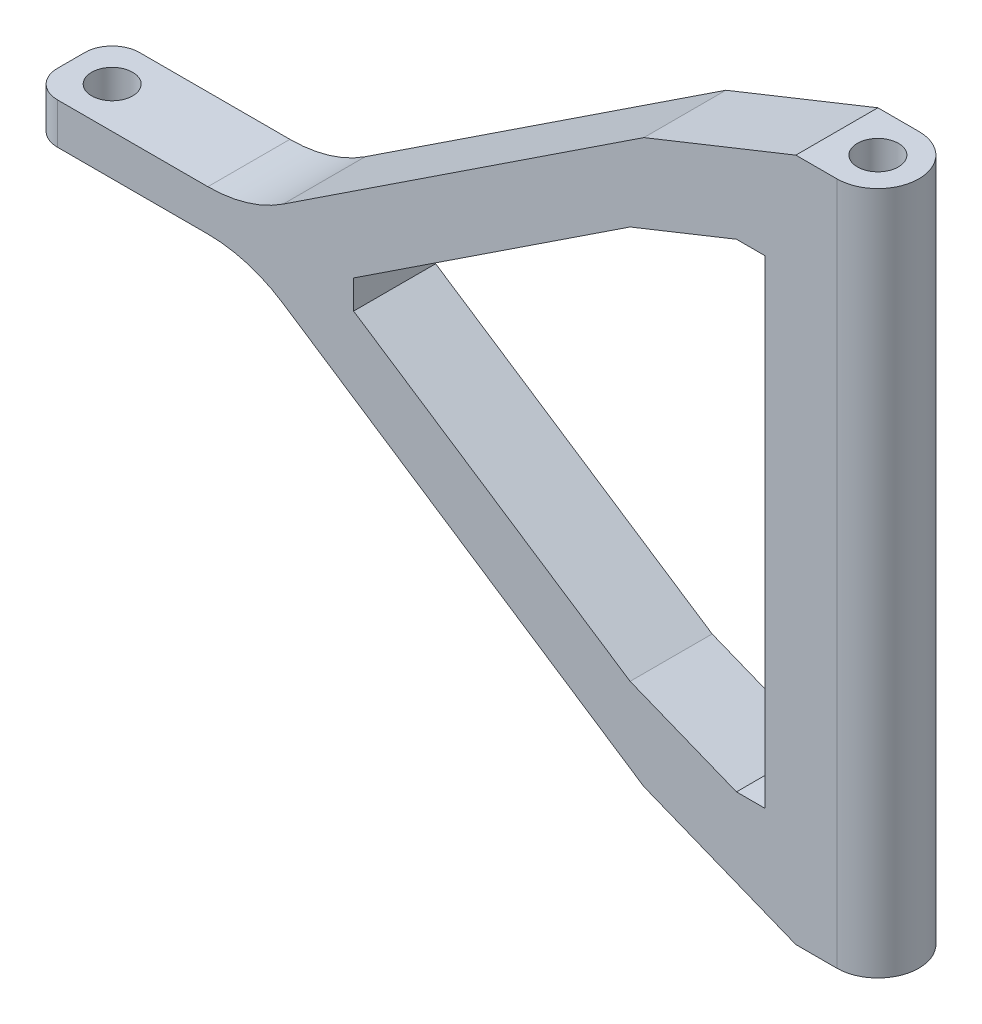
ISO-10303-21;
HEADER;
FILE_DESCRIPTION(('STEP AP214'),'2;1');
FILE_NAME('part.step','',(''),(''),'','','');
FILE_SCHEMA(('AUTOMOTIVE_DESIGN { 1 0 10303 214 1 1 1 1 }'));
ENDSEC;
DATA;
#1=APPLICATION_CONTEXT('core data for automotive mechanical design processes');
#2=APPLICATION_PROTOCOL_DEFINITION('international standard','automotive_design',2000,#1);
#3=PRODUCT_CONTEXT('',#1,'mechanical');
#4=PRODUCT('Part','Part','',(#3));
#5=PRODUCT_RELATED_PRODUCT_CATEGORY('part','',(#4));
#6=PRODUCT_DEFINITION_FORMATION('','',#4);
#7=PRODUCT_DEFINITION_CONTEXT('part definition',#1,'design');
#8=PRODUCT_DEFINITION('design','',#6,#7);
#9=PRODUCT_DEFINITION_SHAPE('','',#8);
#10=(LENGTH_UNIT() NAMED_UNIT(*) SI_UNIT(.MILLI.,.METRE.));
#11=(NAMED_UNIT(*) PLANE_ANGLE_UNIT() SI_UNIT($,.RADIAN.));
#12=(NAMED_UNIT(*) SI_UNIT($,.STERADIAN.) SOLID_ANGLE_UNIT());
#13=UNCERTAINTY_MEASURE_WITH_UNIT(LENGTH_MEASURE(1.E-05),#10,'distance_accuracy_value','');
#14=(GEOMETRIC_REPRESENTATION_CONTEXT(3) GLOBAL_UNCERTAINTY_ASSIGNED_CONTEXT((#13)) GLOBAL_UNIT_ASSIGNED_CONTEXT((#10,
#11,#12)) REPRESENTATION_CONTEXT('',''));
#15=CARTESIAN_POINT('',(0.,0.,0.));
#16=DIRECTION('',(0.,0.,1.));
#17=DIRECTION('',(1.,0.,0.));
#18=AXIS2_PLACEMENT_3D('',#15,#16,#17);
#19=CARTESIAN_POINT('',(0.,50.,-3.));
#20=DIRECTION('',(0.,0.,1.));
#21=DIRECTION('',(1.,0.,0.));
#22=AXIS2_PLACEMENT_3D('',#19,#20,#21);
#23=PLANE('',#22);
#24=DIRECTION('',(-1.,0.,0.));
#25=VECTOR('',#24,1.);
#26=CARTESIAN_POINT('',(0.,26.5,-3.));
#27=LINE('',#26,#25);
#28=CARTESIAN_POINT('',(-46.0010879432227,26.5,-2.99999999999999));
#29=VERTEX_POINT('',#28);
#30=CARTESIAN_POINT('',(-57.,26.5,-2.99999999999999));
#31=VERTEX_POINT('',#30);
#32=EDGE_CURVE('E331',#29,#31,#27,.T.);
#33=ORIENTED_EDGE('',*,*,#32,.F.);
#34=CARTESIAN_POINT('',(-46.0010879432227,36.5,-2.99999999999999));
#35=DIRECTION('',(0.,0.,1.));
#36=DIRECTION('',(1.,0.,0.));
#37=AXIS2_PLACEMENT_3D('',#34,#35,#36);
#38=CIRCLE('',#37,10.);
#39=CARTESIAN_POINT('',(-40.4948343727667,28.1524751202622,-3.));
#40=VERTEX_POINT('',#39);
#41=EDGE_CURVE('E437',#29,#40,#38,.T.);
#42=ORIENTED_EDGE('',*,*,#41,.T.);
#43=DIRECTION('',(0.834752487973776,0.550625357045596,0.));
#44=VECTOR('',#43,1.);
#45=CARTESIAN_POINT('',(-25.2174472028128,38.2298536083441,-3.));
#46=LINE('',#45,#44);
#47=CARTESIAN_POINT('',(-14.1124139151438,45.5550344339423,-3.));
#48=VERTEX_POINT('',#47);
#49=EDGE_CURVE('E338',#40,#48,#46,.T.);
#50=ORIENTED_EDGE('',*,*,#49,.T.);
#51=DIRECTION('',(0.92847669088526,0.371390676354101,0.));
#52=VECTOR('',#51,1.);
#53=CARTESIAN_POINT('',(-53.,30.,-2.99999999999999));
#54=LINE('',#53,#52);
#55=CARTESIAN_POINT('',(-2.99999999999958,50.,-3.));
#56=VERTEX_POINT('',#55);
#57=EDGE_CURVE('E355',#48,#56,#54,.T.);
#58=ORIENTED_EDGE('',*,*,#57,.T.);
#59=DIRECTION('',(-1.,0.,0.));
#60=VECTOR('',#59,1.);
#61=CARTESIAN_POINT('',(0.,50.,-3.));
#62=LINE('',#61,#60);
#63=CARTESIAN_POINT('',(0.,50.,-3.));
#64=VERTEX_POINT('',#63);
#65=EDGE_CURVE('E348',#64,#56,#62,.T.);
#66=ORIENTED_EDGE('',*,*,#65,.F.);
#67=DIRECTION('',(0.,-1.,0.));
#68=VECTOR('',#67,1.);
#69=CARTESIAN_POINT('',(0.,50.,-3.));
#70=LINE('',#69,#68);
#71=CARTESIAN_POINT('',(0.,0.,-3.));
#72=VERTEX_POINT('',#71);
#73=EDGE_CURVE('E358',#64,#72,#70,.T.);
#74=ORIENTED_EDGE('',*,*,#73,.T.);
#75=DIRECTION('',(-1.,0.,0.));
#76=VECTOR('',#75,1.);
#77=CARTESIAN_POINT('',(0.,0.,-3.));
#78=LINE('',#77,#76);
#79=CARTESIAN_POINT('',(-2.99999999999958,0.,-3.));
#80=VERTEX_POINT('',#79);
#81=EDGE_CURVE('E354',#72,#80,#78,.T.);
#82=ORIENTED_EDGE('',*,*,#81,.T.);
#83=DIRECTION('',(0.92847669088526,-0.371390676354101,0.));
#84=VECTOR('',#83,1.);
#85=CARTESIAN_POINT('',(-53.,20.,-2.99999999999999));
#86=LINE('',#85,#84);
#87=CARTESIAN_POINT('',(-14.1124139151438,4.44496556605766,-3.));
#88=VERTEX_POINT('',#87);
#89=EDGE_CURVE('E349',#80,#88,#86,.F.);
#90=ORIENTED_EDGE('',*,*,#89,.T.);
#91=DIRECTION('',(0.834752487973776,-0.550625357045596,0.));
#92=VECTOR('',#91,1.);
#93=CARTESIAN_POINT('',(-2.23565286604977,-3.38926779942358,-3.));
#94=LINE('',#93,#92);
#95=CARTESIAN_POINT('',(-40.4948343727667,21.8475248797378,-3.));
#96=VERTEX_POINT('',#95);
#97=EDGE_CURVE('E409',#96,#88,#94,.T.);
#98=ORIENTED_EDGE('',*,*,#97,.F.);
#99=CARTESIAN_POINT('',(-46.0010879432227,13.5,-2.99999999999999));
#100=DIRECTION('',(0.,0.,1.));
#101=DIRECTION('',(1.,0.,0.));
#102=AXIS2_PLACEMENT_3D('',#99,#100,#101);
#103=CIRCLE('',#102,10.);
#104=CARTESIAN_POINT('',(-46.0010879432227,23.5,-2.99999999999999));
#105=VERTEX_POINT('',#104);
#106=EDGE_CURVE('E11',#96,#105,#103,.T.);
#107=ORIENTED_EDGE('',*,*,#106,.T.);
#108=DIRECTION('',(-1.,0.,0.));
#109=VECTOR('',#108,1.);
#110=CARTESIAN_POINT('',(0.,23.5,-3.));
#111=LINE('',#110,#109);
#112=CARTESIAN_POINT('',(-57.,23.5,-2.99999999999999));
#113=VERTEX_POINT('',#112);
#114=EDGE_CURVE('E334',#105,#113,#111,.T.);
#115=ORIENTED_EDGE('',*,*,#114,.T.);
#116=DIRECTION('',(0.,-1.,0.));
#117=VECTOR('',#116,1.);
#118=CARTESIAN_POINT('',(-57.,50.,-2.99999999999998));
#119=LINE('',#118,#117);
#120=EDGE_CURVE('E315',#113,#31,#119,.F.);
#121=ORIENTED_EDGE('',*,*,#120,.T.);
#122=EDGE_LOOP('',(#33,#42,#50,#58,#66,#74,#82,#90,#98,#107,#115,#121));
#123=FACE_BOUND('',#122,.T.);
#124=DIRECTION('',(0.834752487973776,0.550625357045596,0.));
#125=VECTOR('',#124,1.);
#126=CARTESIAN_POINT('',(-22.688660482303,34.396192518294,-3.));
#127=LINE('',#126,#125);
#128=CARTESIAN_POINT('',(-35.3415557414966,26.05,-3.));
#129=VERTEX_POINT('',#128);
#130=CARTESIAN_POINT('',(-15.1202454820972,39.3885241037596,-3.));
#131=VERTEX_POINT('',#130);
#132=EDGE_CURVE('E191',#129,#131,#127,.T.);
#133=ORIENTED_EDGE('',*,*,#132,.F.);
#134=DIRECTION('',(0.,-1.,0.));
#135=VECTOR('',#134,1.);
#136=CARTESIAN_POINT('',(-35.3415557414966,0.,-3.));
#137=LINE('',#136,#135);
#138=CARTESIAN_POINT('',(-35.3415557414965,23.95,-2.99999999999999));
#139=VERTEX_POINT('',#138);
#140=EDGE_CURVE('E204',#129,#139,#137,.T.);
#141=ORIENTED_EDGE('',*,*,#140,.T.);
#142=DIRECTION('',(0.834752487973776,-0.550625357045596,0.));
#143=VECTOR('',#142,1.);
#144=CARTESIAN_POINT('',(0.293133854460068,0.444393290626501,-3.));
#145=LINE('',#144,#143);
#146=CARTESIAN_POINT('',(-15.1202454820972,10.6114758962404,-3.));
#147=VERTEX_POINT('',#146);
#148=EDGE_CURVE('E209',#139,#147,#145,.T.);
#149=ORIENTED_EDGE('',*,*,#148,.T.);
#150=DIRECTION('',(0.92847669088526,-0.371390676354102,0.));
#151=VECTOR('',#150,1.);
#152=CARTESIAN_POINT('',(1.57357851841431,3.9339462960358,-3.));
#153=LINE('',#152,#151);
#154=CARTESIAN_POINT('',(-7.34155574149625,7.5,-3.));
#155=VERTEX_POINT('',#154);
#156=EDGE_CURVE('E224',#147,#155,#153,.T.);
#157=ORIENTED_EDGE('',*,*,#156,.T.);
#158=DIRECTION('',(1.,0.,0.));
#159=VECTOR('',#158,1.);
#160=CARTESIAN_POINT('',(0.,7.5,-3.));
#161=LINE('',#160,#159);
#162=CARTESIAN_POINT('',(-5.24155574149655,7.5,-3.));
#163=VERTEX_POINT('',#162);
#164=EDGE_CURVE('E228',#155,#163,#161,.T.);
#165=ORIENTED_EDGE('',*,*,#164,.T.);
#166=DIRECTION('',(0.,-1.,0.));
#167=VECTOR('',#166,1.);
#168=CARTESIAN_POINT('',(-5.24155574149655,0.,-3.));
#169=LINE('',#168,#167);
#170=CARTESIAN_POINT('',(-5.24155574149655,42.5,-3.));
#171=VERTEX_POINT('',#170);
#172=EDGE_CURVE('E232',#171,#163,#169,.T.);
#173=ORIENTED_EDGE('',*,*,#172,.F.);
#174=DIRECTION('',(1.,0.,0.));
#175=VECTOR('',#174,1.);
#176=CARTESIAN_POINT('',(0.,42.5,-3.));
#177=LINE('',#176,#175);
#178=CARTESIAN_POINT('',(-7.34155574149625,42.5,-3.));
#179=VERTEX_POINT('',#178);
#180=EDGE_CURVE('E235',#179,#171,#177,.T.);
#181=ORIENTED_EDGE('',*,*,#180,.F.);
#182=DIRECTION('',(-0.92847669088526,-0.371390676354102,0.));
#183=VECTOR('',#182,1.);
#184=CARTESIAN_POINT('',(-15.6678007919304,39.1695019798264,-3.));
#185=LINE('',#184,#183);
#186=EDGE_CURVE('E200',#179,#131,#185,.T.);
#187=ORIENTED_EDGE('',*,*,#186,.T.);
#188=EDGE_LOOP('',(#133,#141,#149,#157,#165,#173,#181,#187));
#189=FACE_BOUND('',#188,.T.);
#190=ADVANCED_FACE('F40',(#123,#189),#23,.F.);
#191=CARTESIAN_POINT('',(-3.,50.,3.));
#192=DIRECTION('',(0.,0.,-1.));
#193=DIRECTION('',(-1.,0.,0.));
#194=AXIS2_PLACEMENT_3D('',#191,#192,#193);
#195=PLANE('',#194);
#196=DIRECTION('',(0.834752487973776,0.550625357045596,0.));
#197=VECTOR('',#196,1.);
#198=CARTESIAN_POINT('',(-25.2174472028128,38.2298536083441,3.));
#199=LINE('',#198,#197);
#200=CARTESIAN_POINT('',(-40.4948343727667,28.1524751202622,3.));
#201=VERTEX_POINT('',#200);
#202=CARTESIAN_POINT('',(-14.1124139151438,45.5550344339423,3.));
#203=VERTEX_POINT('',#202);
#204=EDGE_CURVE('E408',#201,#203,#199,.T.);
#205=ORIENTED_EDGE('',*,*,#204,.F.);
#206=CARTESIAN_POINT('',(-46.0010879432227,36.5,3.));
#207=DIRECTION('',(0.,0.,-1.));
#208=DIRECTION('',(-1.,0.,0.));
#209=AXIS2_PLACEMENT_3D('',#206,#207,#208);
#210=CIRCLE('',#209,10.);
#211=CARTESIAN_POINT('',(-46.0010879432227,26.5,3.));
#212=VERTEX_POINT('',#211);
#213=EDGE_CURVE('E434',#201,#212,#210,.T.);
#214=ORIENTED_EDGE('',*,*,#213,.T.);
#215=DIRECTION('',(1.,0.,0.));
#216=VECTOR('',#215,1.);
#217=CARTESIAN_POINT('',(0.,26.5,3.));
#218=LINE('',#217,#216);
#219=CARTESIAN_POINT('',(-57.,26.5,3.00000000000001));
#220=VERTEX_POINT('',#219);
#221=EDGE_CURVE('E335',#220,#212,#218,.T.);
#222=ORIENTED_EDGE('',*,*,#221,.F.);
#223=DIRECTION('',(0.,1.,0.));
#224=VECTOR('',#223,1.);
#225=CARTESIAN_POINT('',(-57.,50.,3.));
#226=LINE('',#225,#224);
#227=CARTESIAN_POINT('',(-57.,23.5,3.00000000000001));
#228=VERTEX_POINT('',#227);
#229=EDGE_CURVE('E326',#220,#228,#226,.F.);
#230=ORIENTED_EDGE('',*,*,#229,.T.);
#231=DIRECTION('',(1.,0.,0.));
#232=VECTOR('',#231,1.);
#233=CARTESIAN_POINT('',(0.,23.5,3.));
#234=LINE('',#233,#232);
#235=CARTESIAN_POINT('',(-46.0010879432227,23.5,3.));
#236=VERTEX_POINT('',#235);
#237=EDGE_CURVE('E330',#228,#236,#234,.T.);
#238=ORIENTED_EDGE('',*,*,#237,.T.);
#239=CARTESIAN_POINT('',(-46.0010879432227,13.5,3.));
#240=DIRECTION('',(0.,0.,-1.));
#241=DIRECTION('',(-1.,0.,0.));
#242=AXIS2_PLACEMENT_3D('',#239,#240,#241);
#243=CIRCLE('',#242,10.);
#244=CARTESIAN_POINT('',(-40.4948343727667,21.8475248797378,3.));
#245=VERTEX_POINT('',#244);
#246=EDGE_CURVE('E49',#236,#245,#243,.T.);
#247=ORIENTED_EDGE('',*,*,#246,.T.);
#248=DIRECTION('',(0.834752487973776,-0.550625357045596,0.));
#249=VECTOR('',#248,1.);
#250=CARTESIAN_POINT('',(-2.23565286604977,-3.38926779942358,3.));
#251=LINE('',#250,#249);
#252=CARTESIAN_POINT('',(-14.1124139151438,4.44496556605766,3.));
#253=VERTEX_POINT('',#252);
#254=EDGE_CURVE('E368',#245,#253,#251,.T.);
#255=ORIENTED_EDGE('',*,*,#254,.T.);
#256=DIRECTION('',(-0.92847669088526,0.371390676354101,0.));
#257=VECTOR('',#256,1.);
#258=CARTESIAN_POINT('',(-53.,20.,3.));
#259=LINE('',#258,#257);
#260=CARTESIAN_POINT('',(-2.99999999999958,0.,3.));
#261=VERTEX_POINT('',#260);
#262=EDGE_CURVE('E364',#253,#261,#259,.F.);
#263=ORIENTED_EDGE('',*,*,#262,.T.);
#264=DIRECTION('',(1.,0.,0.));
#265=VECTOR('',#264,1.);
#266=CARTESIAN_POINT('',(-3.,0.,3.));
#267=LINE('',#266,#265);
#268=CARTESIAN_POINT('',(0.,0.,3.));
#269=VERTEX_POINT('',#268);
#270=EDGE_CURVE('E367',#261,#269,#267,.T.);
#271=ORIENTED_EDGE('',*,*,#270,.T.);
#272=DIRECTION('',(0.,-1.,0.));
#273=VECTOR('',#272,1.);
#274=CARTESIAN_POINT('',(0.,50.,3.));
#275=LINE('',#274,#273);
#276=CARTESIAN_POINT('',(0.,50.,3.));
#277=VERTEX_POINT('',#276);
#278=EDGE_CURVE('E375',#277,#269,#275,.T.);
#279=ORIENTED_EDGE('',*,*,#278,.F.);
#280=DIRECTION('',(1.,0.,0.));
#281=VECTOR('',#280,1.);
#282=CARTESIAN_POINT('',(-3.,50.,3.));
#283=LINE('',#282,#281);
#284=CARTESIAN_POINT('',(-2.99999999999958,50.,3.));
#285=VERTEX_POINT('',#284);
#286=EDGE_CURVE('E347',#285,#277,#283,.T.);
#287=ORIENTED_EDGE('',*,*,#286,.F.);
#288=DIRECTION('',(-0.92847669088526,-0.371390676354101,0.));
#289=VECTOR('',#288,1.);
#290=CARTESIAN_POINT('',(-53.,30.,3.));
#291=LINE('',#290,#289);
#292=EDGE_CURVE('E353',#285,#203,#291,.T.);
#293=ORIENTED_EDGE('',*,*,#292,.T.);
#294=EDGE_LOOP('',(#205,#214,#222,#230,#238,#247,#255,#263,#271,#279,#287,#293));
#295=FACE_BOUND('',#294,.T.);
#296=DIRECTION('',(0.834752487973776,0.550625357045596,0.));
#297=VECTOR('',#296,1.);
#298=CARTESIAN_POINT('',(-22.688660482303,34.396192518294,3.));
#299=LINE('',#298,#297);
#300=CARTESIAN_POINT('',(-35.3415557414966,26.05,3.));
#301=VERTEX_POINT('',#300);
#302=CARTESIAN_POINT('',(-15.1202454820972,39.3885241037596,3.));
#303=VERTEX_POINT('',#302);
#304=EDGE_CURVE('E194',#301,#303,#299,.T.);
#305=ORIENTED_EDGE('',*,*,#304,.T.);
#306=DIRECTION('',(-0.92847669088526,-0.371390676354102,0.));
#307=VECTOR('',#306,1.);
#308=CARTESIAN_POINT('',(-15.6678007919304,39.1695019798264,3.));
#309=LINE('',#308,#307);
#310=CARTESIAN_POINT('',(-7.34155574149625,42.5,3.));
#311=VERTEX_POINT('',#310);
#312=EDGE_CURVE('E215',#311,#303,#309,.T.);
#313=ORIENTED_EDGE('',*,*,#312,.F.);
#314=DIRECTION('',(1.,0.,0.));
#315=VECTOR('',#314,1.);
#316=CARTESIAN_POINT('',(0.,42.5,3.));
#317=LINE('',#316,#315);
#318=CARTESIAN_POINT('',(-5.24155574149655,42.5,3.));
#319=VERTEX_POINT('',#318);
#320=EDGE_CURVE('E219',#311,#319,#317,.T.);
#321=ORIENTED_EDGE('',*,*,#320,.T.);
#322=DIRECTION('',(0.,-1.,0.));
#323=VECTOR('',#322,1.);
#324=CARTESIAN_POINT('',(-5.24155574149655,0.,3.));
#325=LINE('',#324,#323);
#326=CARTESIAN_POINT('',(-5.24155574149655,7.5,3.));
#327=VERTEX_POINT('',#326);
#328=EDGE_CURVE('E257',#319,#327,#325,.T.);
#329=ORIENTED_EDGE('',*,*,#328,.T.);
#330=DIRECTION('',(1.,0.,0.));
#331=VECTOR('',#330,1.);
#332=CARTESIAN_POINT('',(0.,7.5,3.));
#333=LINE('',#332,#331);
#334=CARTESIAN_POINT('',(-7.34155574149625,7.5,3.));
#335=VERTEX_POINT('',#334);
#336=EDGE_CURVE('E253',#335,#327,#333,.T.);
#337=ORIENTED_EDGE('',*,*,#336,.F.);
#338=DIRECTION('',(0.92847669088526,-0.371390676354102,0.));
#339=VECTOR('',#338,1.);
#340=CARTESIAN_POINT('',(1.57357851841431,3.9339462960358,3.));
#341=LINE('',#340,#339);
#342=CARTESIAN_POINT('',(-15.1202454820972,10.6114758962404,3.));
#343=VERTEX_POINT('',#342);
#344=EDGE_CURVE('E249',#343,#335,#341,.T.);
#345=ORIENTED_EDGE('',*,*,#344,.F.);
#346=DIRECTION('',(0.834752487973776,-0.550625357045596,0.));
#347=VECTOR('',#346,1.);
#348=CARTESIAN_POINT('',(0.293133854460068,0.444393290626501,3.));
#349=LINE('',#348,#347);
#350=CARTESIAN_POINT('',(-35.3415557414966,23.95,3.));
#351=VERTEX_POINT('',#350);
#352=EDGE_CURVE('E245',#351,#343,#349,.T.);
#353=ORIENTED_EDGE('',*,*,#352,.F.);
#354=DIRECTION('',(0.,-1.,0.));
#355=VECTOR('',#354,1.);
#356=CARTESIAN_POINT('',(-35.3415557414966,0.,3.));
#357=LINE('',#356,#355);
#358=EDGE_CURVE('E242',#301,#351,#357,.T.);
#359=ORIENTED_EDGE('',*,*,#358,.F.);
#360=EDGE_LOOP('',(#305,#313,#321,#329,#337,#345,#353,#359));
#361=FACE_BOUND('',#360,.T.);
#362=ADVANCED_FACE('F453',(#295,#361),#195,.F.);
#363=CARTESIAN_POINT('',(-53.,20.,0.));
#364=DIRECTION('',(0.371390676354101,0.92847669088526,0.));
#365=DIRECTION('',(0.,0.,1.));
#366=AXIS2_PLACEMENT_3D('',#363,#364,#365);
#367=PLANE('',#366);
#368=ORIENTED_EDGE('',*,*,#262,.F.);
#369=DIRECTION('',(0.,0.,1.));
#370=VECTOR('',#369,1.);
#371=CARTESIAN_POINT('',(-14.1124139151438,4.44496556605766,-3.));
#372=LINE('',#371,#370);
#373=EDGE_CURVE('E404',#88,#253,#372,.T.);
#374=ORIENTED_EDGE('',*,*,#373,.F.);
#375=ORIENTED_EDGE('',*,*,#89,.F.);
#376=DIRECTION('',(0.,0.,-1.));
#377=VECTOR('',#376,1.);
#378=CARTESIAN_POINT('',(-2.99999999999958,0.,0.));
#379=LINE('',#378,#377);
#380=EDGE_CURVE('E359',#261,#80,#379,.T.);
#381=ORIENTED_EDGE('',*,*,#380,.F.);
#382=EDGE_LOOP('',(#368,#374,#375,#381));
#383=FACE_BOUND('',#382,.T.);
#384=ADVANCED_FACE('F477',(#383),#367,.F.);
#385=CARTESIAN_POINT('',(0.,50.,0.));
#386=DIRECTION('',(0.,1.,0.));
#387=DIRECTION('',(0.,0.,1.));
#388=AXIS2_PLACEMENT_3D('',#385,#386,#387);
#389=PLANE('',#388);
#390=ORIENTED_EDGE('',*,*,#65,.T.);
#391=DIRECTION('',(0.,0.,1.));
#392=VECTOR('',#391,1.);
#393=CARTESIAN_POINT('',(-2.99999999999958,50.,3.));
#394=LINE('',#393,#392);
#395=EDGE_CURVE('E344',#56,#285,#394,.T.);
#396=ORIENTED_EDGE('',*,*,#395,.T.);
#397=ORIENTED_EDGE('',*,*,#286,.T.);
#398=CARTESIAN_POINT('',(0.,50.,0.));
#399=DIRECTION('',(0.,1.,0.));
#400=DIRECTION('',(0.,0.,1.));
#401=AXIS2_PLACEMENT_3D('',#398,#399,#400);
#402=CIRCLE('',#401,3.);
#403=EDGE_CURVE('E363',#277,#64,#402,.T.);
#404=ORIENTED_EDGE('',*,*,#403,.T.);
#405=EDGE_LOOP('',(#390,#396,#397,#404));
#406=FACE_BOUND('',#405,.T.);
#407=CARTESIAN_POINT('',(0.,50.,0.));
#408=DIRECTION('',(0.,1.,0.));
#409=DIRECTION('',(0.,0.,1.));
#410=AXIS2_PLACEMENT_3D('',#407,#408,#409);
#411=CIRCLE('',#410,1.5);
#412=CARTESIAN_POINT('',(0.,50.,1.5));
#413=VERTEX_POINT('',#412);
#414=EDGE_CURVE('E379',#413,#413,#411,.T.);
#415=ORIENTED_EDGE('',*,*,#414,.F.);
#416=EDGE_LOOP('',(#415));
#417=FACE_BOUND('',#416,.T.);
#418=ADVANCED_FACE('F495',(#406,#417),#389,.T.);
#419=CARTESIAN_POINT('',(0.,0.,0.));
#420=DIRECTION('',(0.,1.,0.));
#421=DIRECTION('',(0.,0.,1.));
#422=AXIS2_PLACEMENT_3D('',#419,#420,#421);
#423=PLANE('',#422);
#424=ORIENTED_EDGE('',*,*,#270,.F.);
#425=ORIENTED_EDGE('',*,*,#380,.T.);
#426=ORIENTED_EDGE('',*,*,#81,.F.);
#427=CARTESIAN_POINT('',(0.,0.,0.));
#428=DIRECTION('',(0.,1.,0.));
#429=DIRECTION('',(0.,0.,1.));
#430=AXIS2_PLACEMENT_3D('',#427,#428,#429);
#431=CIRCLE('',#430,3.);
#432=EDGE_CURVE('E380',#269,#72,#431,.T.);
#433=ORIENTED_EDGE('',*,*,#432,.F.);
#434=EDGE_LOOP('',(#424,#425,#426,#433));
#435=FACE_BOUND('',#434,.T.);
#436=CARTESIAN_POINT('',(0.,0.,0.));
#437=DIRECTION('',(0.,1.,0.));
#438=DIRECTION('',(0.,0.,1.));
#439=AXIS2_PLACEMENT_3D('',#436,#437,#438);
#440=CIRCLE('',#439,1.5);
#441=CARTESIAN_POINT('',(0.,0.,1.5));
#442=VERTEX_POINT('',#441);
#443=EDGE_CURVE('E362',#442,#442,#440,.T.);
#444=ORIENTED_EDGE('',*,*,#443,.T.);
#445=EDGE_LOOP('',(#444));
#446=FACE_BOUND('',#445,.T.);
#447=ADVANCED_FACE('F483',(#435,#446),#423,.F.);
#448=CARTESIAN_POINT('',(0.,50.,0.));
#449=DIRECTION('',(0.,-1.,0.));
#450=DIRECTION('',(0.,0.,-1.));
#451=AXIS2_PLACEMENT_3D('',#448,#449,#450);
#452=CYLINDRICAL_SURFACE('',#451,3.);
#453=ORIENTED_EDGE('',*,*,#432,.T.);
#454=ORIENTED_EDGE('',*,*,#73,.F.);
#455=ORIENTED_EDGE('',*,*,#403,.F.);
#456=ORIENTED_EDGE('',*,*,#278,.T.);
#457=EDGE_LOOP('',(#453,#454,#455,#456));
#458=FACE_BOUND('',#457,.T.);
#459=ADVANCED_FACE('F487',(#458),#452,.T.);
#460=CARTESIAN_POINT('',(0.,50.,0.));
#461=DIRECTION('',(0.,-1.,0.));
#462=DIRECTION('',(0.,0.,-1.));
#463=AXIS2_PLACEMENT_3D('',#460,#461,#462);
#464=CYLINDRICAL_SURFACE('',#463,1.5);
#465=ORIENTED_EDGE('',*,*,#414,.T.);
#466=EDGE_LOOP('',(#465));
#467=FACE_BOUND('',#466,.T.);
#468=ORIENTED_EDGE('',*,*,#443,.F.);
#469=EDGE_LOOP('',(#468));
#470=FACE_BOUND('',#469,.T.);
#471=ADVANCED_FACE('F501',(#467,#470),#464,.F.);
#472=CARTESIAN_POINT('',(-53.,30.,0.));
#473=DIRECTION('',(-0.371390676354101,0.92847669088526,0.));
#474=DIRECTION('',(0.,0.,1.));
#475=AXIS2_PLACEMENT_3D('',#472,#473,#474);
#476=PLANE('',#475);
#477=DIRECTION('',(0.,0.,1.));
#478=VECTOR('',#477,1.);
#479=CARTESIAN_POINT('',(-14.1124139151438,45.5550344339423,-3.));
#480=LINE('',#479,#478);
#481=EDGE_CURVE('E403',#48,#203,#480,.T.);
#482=ORIENTED_EDGE('',*,*,#481,.T.);
#483=ORIENTED_EDGE('',*,*,#292,.F.);
#484=ORIENTED_EDGE('',*,*,#395,.F.);
#485=ORIENTED_EDGE('',*,*,#57,.F.);
#486=EDGE_LOOP('',(#482,#483,#484,#485));
#487=FACE_BOUND('',#486,.T.);
#488=ADVANCED_FACE('F494',(#487),#476,.T.);
#489=CARTESIAN_POINT('',(-2.23565286604977,-3.38926779942358,-3.));
#490=DIRECTION('',(-0.550625357045596,-0.834752487973776,0.));
#491=DIRECTION('',(0.834752487973776,-0.550625357045596,0.));
#492=AXIS2_PLACEMENT_3D('',#489,#490,#491);
#493=PLANE('',#492);
#494=ORIENTED_EDGE('',*,*,#254,.F.);
#495=DIRECTION('',(0.,0.,1.));
#496=VECTOR('',#495,1.);
#497=CARTESIAN_POINT('',(-40.4948343727667,21.8475248797378,-2.99999999999999));
#498=LINE('',#497,#496);
#499=EDGE_CURVE('E56',#245,#96,#498,.F.);
#500=ORIENTED_EDGE('',*,*,#499,.T.);
#501=ORIENTED_EDGE('',*,*,#97,.T.);
#502=ORIENTED_EDGE('',*,*,#373,.T.);
#503=EDGE_LOOP('',(#494,#500,#501,#502));
#504=FACE_BOUND('',#503,.T.);
#505=ADVANCED_FACE('F474',(#504),#493,.T.);
#506=CARTESIAN_POINT('',(-25.2174472028128,38.2298536083441,-3.));
#507=DIRECTION('',(0.550625357045596,-0.834752487973776,0.));
#508=DIRECTION('',(0.834752487973776,0.550625357045596,0.));
#509=AXIS2_PLACEMENT_3D('',#506,#507,#508);
#510=PLANE('',#509);
#511=ORIENTED_EDGE('',*,*,#49,.F.);
#512=DIRECTION('',(0.,0.,1.));
#513=VECTOR('',#512,1.);
#514=CARTESIAN_POINT('',(-40.4948343727667,28.1524751202622,3.));
#515=LINE('',#514,#513);
#516=EDGE_CURVE('E419',#40,#201,#515,.T.);
#517=ORIENTED_EDGE('',*,*,#516,.T.);
#518=ORIENTED_EDGE('',*,*,#204,.T.);
#519=ORIENTED_EDGE('',*,*,#481,.F.);
#520=EDGE_LOOP('',(#511,#517,#518,#519));
#521=FACE_BOUND('',#520,.T.);
#522=ADVANCED_FACE('F449',(#521),#510,.F.);
#523=CARTESIAN_POINT('',(0.,23.5,-61.29030794223));
#524=DIRECTION('',(0.,-1.,0.));
#525=DIRECTION('',(0.,0.,-1.));
#526=AXIS2_PLACEMENT_3D('',#523,#524,#525);
#527=PLANE('',#526);
#528=ORIENTED_EDGE('',*,*,#114,.F.);
#529=DIRECTION('',(0.,0.,1.));
#530=VECTOR('',#529,1.);
#531=CARTESIAN_POINT('',(-46.0010879432227,23.5,3.));
#532=LINE('',#531,#530);
#533=EDGE_CURVE('E428',#105,#236,#532,.T.);
#534=ORIENTED_EDGE('',*,*,#533,.T.);
#535=ORIENTED_EDGE('',*,*,#237,.F.);
#536=CARTESIAN_POINT('',(-57.,23.5,1.));
#537=DIRECTION('',(0.,1.,0.));
#538=DIRECTION('',(0.,0.,1.));
#539=AXIS2_PLACEMENT_3D('',#536,#537,#538);
#540=CIRCLE('',#539,2.);
#541=CARTESIAN_POINT('',(-59.,23.5,1.));
#542=VERTEX_POINT('',#541);
#543=EDGE_CURVE('E308',#228,#542,#540,.F.);
#544=ORIENTED_EDGE('',*,*,#543,.T.);
#545=DIRECTION('',(0.,0.,1.));
#546=VECTOR('',#545,1.);
#547=CARTESIAN_POINT('',(-59.,23.5,-2.99999999999999));
#548=LINE('',#547,#546);
#549=CARTESIAN_POINT('',(-59.,23.5,-0.999999999999984));
#550=VERTEX_POINT('',#549);
#551=EDGE_CURVE('E296',#550,#542,#548,.T.);
#552=ORIENTED_EDGE('',*,*,#551,.F.);
#553=CARTESIAN_POINT('',(-57.,23.5,-0.999999999999984));
#554=DIRECTION('',(0.,1.,0.));
#555=DIRECTION('',(0.,0.,1.));
#556=AXIS2_PLACEMENT_3D('',#553,#554,#555);
#557=CIRCLE('',#556,2.);
#558=EDGE_CURVE('E311',#550,#113,#557,.F.);
#559=ORIENTED_EDGE('',*,*,#558,.T.);
#560=EDGE_LOOP('',(#528,#534,#535,#544,#552,#559));
#561=FACE_BOUND('',#560,.T.);
#562=CARTESIAN_POINT('',(-56.,23.5,0.));
#563=DIRECTION('',(0.,-1.,0.));
#564=DIRECTION('',(0.,0.,-1.));
#565=AXIS2_PLACEMENT_3D('',#562,#563,#564);
#566=CIRCLE('',#565,1.5);
#567=CARTESIAN_POINT('',(-56.,23.5,-1.5));
#568=VERTEX_POINT('',#567);
#569=EDGE_CURVE('E267',#568,#568,#566,.T.);
#570=ORIENTED_EDGE('',*,*,#569,.F.);
#571=EDGE_LOOP('',(#570));
#572=FACE_BOUND('',#571,.T.);
#573=ADVANCED_FACE('F466',(#561,#572),#527,.T.);
#574=CARTESIAN_POINT('',(0.,26.5,-61.29030794223));
#575=DIRECTION('',(0.,-1.,0.));
#576=DIRECTION('',(0.,0.,-1.));
#577=AXIS2_PLACEMENT_3D('',#574,#575,#576);
#578=PLANE('',#577);
#579=ORIENTED_EDGE('',*,*,#221,.T.);
#580=DIRECTION('',(0.,0.,1.));
#581=VECTOR('',#580,1.);
#582=CARTESIAN_POINT('',(-46.0010879432227,26.5,-2.99999999999999));
#583=LINE('',#582,#581);
#584=EDGE_CURVE('E425',#212,#29,#583,.F.);
#585=ORIENTED_EDGE('',*,*,#584,.T.);
#586=ORIENTED_EDGE('',*,*,#32,.T.);
#587=CARTESIAN_POINT('',(-57.,26.5,-0.999999999999984));
#588=DIRECTION('',(0.,-1.,0.));
#589=DIRECTION('',(0.,0.,-1.));
#590=AXIS2_PLACEMENT_3D('',#587,#588,#589);
#591=CIRCLE('',#590,2.);
#592=CARTESIAN_POINT('',(-59.,26.5,-0.999999999999984));
#593=VERTEX_POINT('',#592);
#594=EDGE_CURVE('E323',#31,#593,#591,.F.);
#595=ORIENTED_EDGE('',*,*,#594,.T.);
#596=DIRECTION('',(0.,0.,-1.));
#597=VECTOR('',#596,1.);
#598=CARTESIAN_POINT('',(-59.,26.5,-2.99999999999999));
#599=LINE('',#598,#597);
#600=CARTESIAN_POINT('',(-59.,26.5,1.));
#601=VERTEX_POINT('',#600);
#602=EDGE_CURVE('E292',#601,#593,#599,.T.);
#603=ORIENTED_EDGE('',*,*,#602,.F.);
#604=CARTESIAN_POINT('',(-57.,26.5,1.));
#605=DIRECTION('',(0.,-1.,0.));
#606=DIRECTION('',(0.,0.,-1.));
#607=AXIS2_PLACEMENT_3D('',#604,#605,#606);
#608=CIRCLE('',#607,2.);
#609=EDGE_CURVE('E319',#601,#220,#608,.F.);
#610=ORIENTED_EDGE('',*,*,#609,.T.);
#611=EDGE_LOOP('',(#579,#585,#586,#595,#603,#610));
#612=FACE_BOUND('',#611,.T.);
#613=CARTESIAN_POINT('',(-56.,26.5,0.));
#614=DIRECTION('',(0.,-1.,0.));
#615=DIRECTION('',(0.,0.,-1.));
#616=AXIS2_PLACEMENT_3D('',#613,#614,#615);
#617=CIRCLE('',#616,1.5);
#618=CARTESIAN_POINT('',(-56.,26.5,-1.5));
#619=VERTEX_POINT('',#618);
#620=EDGE_CURVE('E288',#619,#619,#617,.T.);
#621=ORIENTED_EDGE('',*,*,#620,.T.);
#622=EDGE_LOOP('',(#621));
#623=FACE_BOUND('',#622,.T.);
#624=ADVANCED_FACE('F456',(#612,#623),#578,.F.);
#625=CARTESIAN_POINT('',(-57.,0.,1.));
#626=DIRECTION('',(0.,1.,0.));
#627=DIRECTION('',(0.,0.,1.));
#628=AXIS2_PLACEMENT_3D('',#625,#626,#627);
#629=CYLINDRICAL_SURFACE('',#628,2.);
#630=ORIENTED_EDGE('',*,*,#543,.F.);
#631=ORIENTED_EDGE('',*,*,#229,.F.);
#632=ORIENTED_EDGE('',*,*,#609,.F.);
#633=DIRECTION('',(0.,1.,0.));
#634=VECTOR('',#633,1.);
#635=CARTESIAN_POINT('',(-59.,0.,1.));
#636=LINE('',#635,#634);
#637=EDGE_CURVE('E300',#542,#601,#636,.T.);
#638=ORIENTED_EDGE('',*,*,#637,.F.);
#639=EDGE_LOOP('',(#630,#631,#632,#638));
#640=FACE_BOUND('',#639,.T.);
#641=ADVANCED_FACE('F463',(#640),#629,.T.);
#642=CARTESIAN_POINT('',(-57.,0.,-0.999999999999984));
#643=DIRECTION('',(0.,-1.,0.));
#644=DIRECTION('',(0.,0.,-1.));
#645=AXIS2_PLACEMENT_3D('',#642,#643,#644);
#646=CYLINDRICAL_SURFACE('',#645,2.);
#647=ORIENTED_EDGE('',*,*,#594,.F.);
#648=ORIENTED_EDGE('',*,*,#120,.F.);
#649=ORIENTED_EDGE('',*,*,#558,.F.);
#650=DIRECTION('',(0.,-1.,0.));
#651=VECTOR('',#650,1.);
#652=CARTESIAN_POINT('',(-59.,0.,-0.999999999999984));
#653=LINE('',#652,#651);
#654=EDGE_CURVE('E304',#593,#550,#653,.T.);
#655=ORIENTED_EDGE('',*,*,#654,.F.);
#656=EDGE_LOOP('',(#647,#648,#649,#655));
#657=FACE_BOUND('',#656,.T.);
#658=ADVANCED_FACE('F544',(#657),#646,.T.);
#659=CARTESIAN_POINT('',(-59.,0.,0.));
#660=DIRECTION('',(1.,0.,0.));
#661=DIRECTION('',(0.,0.,-1.));
#662=AXIS2_PLACEMENT_3D('',#659,#660,#661);
#663=PLANE('',#662);
#664=ORIENTED_EDGE('',*,*,#602,.T.);
#665=ORIENTED_EDGE('',*,*,#654,.T.);
#666=ORIENTED_EDGE('',*,*,#551,.T.);
#667=ORIENTED_EDGE('',*,*,#637,.T.);
#668=EDGE_LOOP('',(#664,#665,#666,#667));
#669=FACE_BOUND('',#668,.T.);
#670=ADVANCED_FACE('F540',(#669),#663,.F.);
#671=CARTESIAN_POINT('',(-56.,50.,0.));
#672=DIRECTION('',(0.,-1.,0.));
#673=DIRECTION('',(0.,0.,-1.));
#674=AXIS2_PLACEMENT_3D('',#671,#672,#673);
#675=CYLINDRICAL_SURFACE('',#674,1.5);
#676=ORIENTED_EDGE('',*,*,#569,.T.);
#677=EDGE_LOOP('',(#676));
#678=FACE_BOUND('',#677,.T.);
#679=ORIENTED_EDGE('',*,*,#620,.F.);
#680=EDGE_LOOP('',(#679));
#681=FACE_BOUND('',#680,.T.);
#682=ADVANCED_FACE('F537',(#678,#681),#675,.F.);
#683=CARTESIAN_POINT('',(-22.688660482303,34.396192518294,-3.));
#684=DIRECTION('',(0.550625357045596,-0.834752487973776,0.));
#685=DIRECTION('',(0.834752487973776,0.550625357045596,0.));
#686=AXIS2_PLACEMENT_3D('',#683,#684,#685);
#687=PLANE('',#686);
#688=ORIENTED_EDGE('',*,*,#304,.F.);
#689=DIRECTION('',(0.,0.,1.));
#690=VECTOR('',#689,1.);
#691=CARTESIAN_POINT('',(-35.3415557414966,26.05,-3.));
#692=LINE('',#691,#690);
#693=EDGE_CURVE('E187',#129,#301,#692,.T.);
#694=ORIENTED_EDGE('',*,*,#693,.F.);
#695=ORIENTED_EDGE('',*,*,#132,.T.);
#696=DIRECTION('',(0.,0.,1.));
#697=VECTOR('',#696,1.);
#698=CARTESIAN_POINT('',(-15.1202454820972,39.3885241037596,-3.));
#699=LINE('',#698,#697);
#700=EDGE_CURVE('E264',#131,#303,#699,.T.);
#701=ORIENTED_EDGE('',*,*,#700,.T.);
#702=EDGE_LOOP('',(#688,#694,#695,#701));
#703=FACE_BOUND('',#702,.T.);
#704=ADVANCED_FACE('F189',(#703),#687,.T.);
#705=CARTESIAN_POINT('',(-15.6678007919304,39.1695019798264,-3.));
#706=DIRECTION('',(-0.371390676354102,0.92847669088526,0.));
#707=DIRECTION('',(-0.92847669088526,-0.371390676354102,0.));
#708=AXIS2_PLACEMENT_3D('',#705,#706,#707);
#709=PLANE('',#708);
#710=ORIENTED_EDGE('',*,*,#312,.T.);
#711=ORIENTED_EDGE('',*,*,#700,.F.);
#712=ORIENTED_EDGE('',*,*,#186,.F.);
#713=DIRECTION('',(0.,0.,1.));
#714=VECTOR('',#713,1.);
#715=CARTESIAN_POINT('',(-7.34155574149625,42.5,-3.));
#716=LINE('',#715,#714);
#717=EDGE_CURVE('E268',#179,#311,#716,.T.);
#718=ORIENTED_EDGE('',*,*,#717,.T.);
#719=EDGE_LOOP('',(#710,#711,#712,#718));
#720=FACE_BOUND('',#719,.T.);
#721=ADVANCED_FACE('F536',(#720),#709,.F.);
#722=CARTESIAN_POINT('',(0.,42.5,-3.));
#723=DIRECTION('',(0.,-1.,0.));
#724=DIRECTION('',(0.,0.,-1.));
#725=AXIS2_PLACEMENT_3D('',#722,#723,#724);
#726=PLANE('',#725);
#727=ORIENTED_EDGE('',*,*,#320,.F.);
#728=ORIENTED_EDGE('',*,*,#717,.F.);
#729=ORIENTED_EDGE('',*,*,#180,.T.);
#730=DIRECTION('',(0.,0.,1.));
#731=VECTOR('',#730,1.);
#732=CARTESIAN_POINT('',(-5.24155574149655,42.5,-3.));
#733=LINE('',#732,#731);
#734=EDGE_CURVE('E271',#171,#319,#733,.T.);
#735=ORIENTED_EDGE('',*,*,#734,.T.);
#736=EDGE_LOOP('',(#727,#728,#729,#735));
#737=FACE_BOUND('',#736,.T.);
#738=ADVANCED_FACE('F674',(#737),#726,.T.);
#739=CARTESIAN_POINT('',(-5.24155574149655,0.,-3.));
#740=DIRECTION('',(-1.,0.,0.));
#741=DIRECTION('',(0.,0.,1.));
#742=AXIS2_PLACEMENT_3D('',#739,#740,#741);
#743=PLANE('',#742);
#744=ORIENTED_EDGE('',*,*,#328,.F.);
#745=ORIENTED_EDGE('',*,*,#734,.F.);
#746=ORIENTED_EDGE('',*,*,#172,.T.);
#747=DIRECTION('',(0.,0.,1.));
#748=VECTOR('',#747,1.);
#749=CARTESIAN_POINT('',(-5.24155574149655,7.5,-3.));
#750=LINE('',#749,#748);
#751=EDGE_CURVE('E274',#163,#327,#750,.T.);
#752=ORIENTED_EDGE('',*,*,#751,.T.);
#753=EDGE_LOOP('',(#744,#745,#746,#752));
#754=FACE_BOUND('',#753,.T.);
#755=ADVANCED_FACE('F682',(#754),#743,.T.);
#756=CARTESIAN_POINT('',(0.,7.5,-3.));
#757=DIRECTION('',(0.,-1.,0.));
#758=DIRECTION('',(0.,0.,-1.));
#759=AXIS2_PLACEMENT_3D('',#756,#757,#758);
#760=PLANE('',#759);
#761=ORIENTED_EDGE('',*,*,#336,.T.);
#762=ORIENTED_EDGE('',*,*,#751,.F.);
#763=ORIENTED_EDGE('',*,*,#164,.F.);
#764=DIRECTION('',(0.,0.,1.));
#765=VECTOR('',#764,1.);
#766=CARTESIAN_POINT('',(-7.34155574149625,7.5,-3.));
#767=LINE('',#766,#765);
#768=EDGE_CURVE('E277',#155,#335,#767,.T.);
#769=ORIENTED_EDGE('',*,*,#768,.T.);
#770=EDGE_LOOP('',(#761,#762,#763,#769));
#771=FACE_BOUND('',#770,.T.);
#772=ADVANCED_FACE('F690',(#771),#760,.F.);
#773=CARTESIAN_POINT('',(1.57357851841431,3.9339462960358,-3.));
#774=DIRECTION('',(-0.371390676354102,-0.92847669088526,0.));
#775=DIRECTION('',(0.92847669088526,-0.371390676354102,0.));
#776=AXIS2_PLACEMENT_3D('',#773,#774,#775);
#777=PLANE('',#776);
#778=ORIENTED_EDGE('',*,*,#344,.T.);
#779=ORIENTED_EDGE('',*,*,#768,.F.);
#780=ORIENTED_EDGE('',*,*,#156,.F.);
#781=DIRECTION('',(0.,0.,1.));
#782=VECTOR('',#781,1.);
#783=CARTESIAN_POINT('',(-15.1202454820972,10.6114758962404,-3.));
#784=LINE('',#783,#782);
#785=EDGE_CURVE('E280',#147,#343,#784,.T.);
#786=ORIENTED_EDGE('',*,*,#785,.T.);
#787=EDGE_LOOP('',(#778,#779,#780,#786));
#788=FACE_BOUND('',#787,.T.);
#789=ADVANCED_FACE('F529',(#788),#777,.F.);
#790=CARTESIAN_POINT('',(0.293133854460068,0.444393290626501,-3.));
#791=DIRECTION('',(-0.550625357045596,-0.834752487973776,0.));
#792=DIRECTION('',(0.834752487973776,-0.550625357045596,0.));
#793=AXIS2_PLACEMENT_3D('',#790,#791,#792);
#794=PLANE('',#793);
#795=ORIENTED_EDGE('',*,*,#352,.T.);
#796=ORIENTED_EDGE('',*,*,#785,.F.);
#797=ORIENTED_EDGE('',*,*,#148,.F.);
#798=DIRECTION('',(0.,0.,1.));
#799=VECTOR('',#798,1.);
#800=CARTESIAN_POINT('',(-35.3415557414966,23.95,-3.));
#801=LINE('',#800,#799);
#802=EDGE_CURVE('E199',#139,#351,#801,.T.);
#803=ORIENTED_EDGE('',*,*,#802,.T.);
#804=EDGE_LOOP('',(#795,#796,#797,#803));
#805=FACE_BOUND('',#804,.T.);
#806=ADVANCED_FACE('F525',(#805),#794,.F.);
#807=CARTESIAN_POINT('',(-35.3415557414966,0.,-3.));
#808=DIRECTION('',(-1.,0.,0.));
#809=DIRECTION('',(0.,0.,1.));
#810=AXIS2_PLACEMENT_3D('',#807,#808,#809);
#811=PLANE('',#810);
#812=ORIENTED_EDGE('',*,*,#358,.T.);
#813=ORIENTED_EDGE('',*,*,#802,.F.);
#814=ORIENTED_EDGE('',*,*,#140,.F.);
#815=ORIENTED_EDGE('',*,*,#693,.T.);
#816=EDGE_LOOP('',(#812,#813,#814,#815));
#817=FACE_BOUND('',#816,.T.);
#818=ADVANCED_FACE('F205',(#817),#811,.F.);
#819=CARTESIAN_POINT('',(-46.0010879432227,36.5,-3.));
#820=DIRECTION('',(0.,0.,-1.));
#821=DIRECTION('',(-1.,0.,0.));
#822=AXIS2_PLACEMENT_3D('',#819,#820,#821);
#823=CYLINDRICAL_SURFACE('',#822,10.);
#824=ORIENTED_EDGE('',*,*,#41,.F.);
#825=ORIENTED_EDGE('',*,*,#584,.F.);
#826=ORIENTED_EDGE('',*,*,#213,.F.);
#827=ORIENTED_EDGE('',*,*,#516,.F.);
#828=EDGE_LOOP('',(#824,#825,#826,#827));
#829=FACE_BOUND('',#828,.T.);
#830=ADVANCED_FACE('F452',(#829),#823,.F.);
#831=CARTESIAN_POINT('',(-46.0010879432227,13.5,-61.29030794223));
#832=DIRECTION('',(0.,0.,-1.));
#833=DIRECTION('',(-1.,0.,0.));
#834=AXIS2_PLACEMENT_3D('',#831,#832,#833);
#835=CYLINDRICAL_SURFACE('',#834,10.);
#836=ORIENTED_EDGE('',*,*,#106,.F.);
#837=ORIENTED_EDGE('',*,*,#499,.F.);
#838=ORIENTED_EDGE('',*,*,#246,.F.);
#839=ORIENTED_EDGE('',*,*,#533,.F.);
#840=EDGE_LOOP('',(#836,#837,#838,#839));
#841=FACE_BOUND('',#840,.T.);
#842=ADVANCED_FACE('F42',(#841),#835,.F.);
#843=CLOSED_SHELL('',(#190,#362,#384,#418,#447,#459,#471,#488,#505,#522,#573,#624,#641,#658,
#670,#682,#704,#721,#738,#755,#772,#789,#806,#818,#830,#842));
#844=MANIFOLD_SOLID_BREP('B2',#843);
#845=ADVANCED_BREP_SHAPE_REPRESENTATION('',(#18,#844),#14);
#846=SHAPE_DEFINITION_REPRESENTATION(#9,#845);
ENDSEC;
END-ISO-10303-21;
